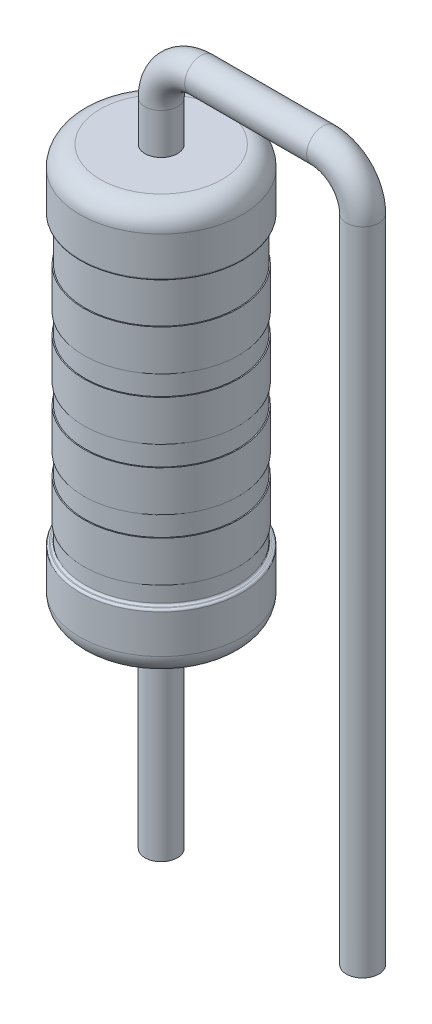
ISO-10303-21;
HEADER;
FILE_DESCRIPTION(('STEP AP214'),'2;1');
FILE_NAME('part.step','',(''),(''),'','','');
FILE_SCHEMA(('AUTOMOTIVE_DESIGN { 1 0 10303 214 1 1 1 1 }'));
ENDSEC;
DATA;
#1=APPLICATION_CONTEXT('core data for automotive mechanical design processes');
#2=APPLICATION_PROTOCOL_DEFINITION('international standard','automotive_design',2000,#1);
#3=PRODUCT_CONTEXT('',#1,'mechanical');
#4=PRODUCT('Part','Part','',(#3));
#5=PRODUCT_RELATED_PRODUCT_CATEGORY('part','',(#4));
#6=PRODUCT_DEFINITION_FORMATION('','',#4);
#7=PRODUCT_DEFINITION_CONTEXT('part definition',#1,'design');
#8=PRODUCT_DEFINITION('design','',#6,#7);
#9=PRODUCT_DEFINITION_SHAPE('','',#8);
#10=(LENGTH_UNIT() NAMED_UNIT(*) SI_UNIT(.MILLI.,.METRE.));
#11=(NAMED_UNIT(*) PLANE_ANGLE_UNIT() SI_UNIT($,.RADIAN.));
#12=(NAMED_UNIT(*) SI_UNIT($,.STERADIAN.) SOLID_ANGLE_UNIT());
#13=UNCERTAINTY_MEASURE_WITH_UNIT(LENGTH_MEASURE(1.E-05),#10,'distance_accuracy_value','');
#14=(GEOMETRIC_REPRESENTATION_CONTEXT(3) GLOBAL_UNCERTAINTY_ASSIGNED_CONTEXT((#13)) GLOBAL_UNIT_ASSIGNED_CONTEXT((#10,
#11,#12)) REPRESENTATION_CONTEXT('',''));
#15=CARTESIAN_POINT('',(0.,0.,0.));
#16=DIRECTION('',(0.,0.,1.));
#17=DIRECTION('',(1.,0.,0.));
#18=AXIS2_PLACEMENT_3D('',#15,#16,#17);
#19=CARTESIAN_POINT('',(0.,5.,0.));
#20=DIRECTION('',(0.,1.,0.));
#21=DIRECTION('',(0.,0.,1.));
#22=AXIS2_PLACEMENT_3D('',#19,#20,#21);
#23=CYLINDRICAL_SURFACE('',#22,1.875);
#24=CARTESIAN_POINT('',(0.,-2.05,0.));
#25=DIRECTION('',(0.,1.,0.));
#26=DIRECTION('',(0.,0.,1.));
#27=AXIS2_PLACEMENT_3D('',#24,#25,#26);
#28=CIRCLE('',#27,1.875);
#29=CARTESIAN_POINT('',(0.,-2.05,1.875));
#30=VERTEX_POINT('',#29);
#31=EDGE_CURVE('E11',#30,#30,#28,.F.);
#32=ORIENTED_EDGE('',*,*,#31,.F.);
#33=EDGE_LOOP('',(#32));
#34=FACE_BOUND('',#33,.T.);
#35=CARTESIAN_POINT('',(0.,-1.55,0.));
#36=DIRECTION('',(0.,-1.,0.));
#37=DIRECTION('',(0.,0.,-1.));
#38=AXIS2_PLACEMENT_3D('',#35,#36,#37);
#39=CIRCLE('',#38,1.875);
#40=CARTESIAN_POINT('',(0.,-1.55,-1.875));
#41=VERTEX_POINT('',#40);
#42=EDGE_CURVE('E138',#41,#41,#39,.F.);
#43=ORIENTED_EDGE('',*,*,#42,.F.);
#44=EDGE_LOOP('',(#43));
#45=FACE_BOUND('',#44,.T.);
#46=ADVANCED_FACE('F41',(#34,#45),#23,.T.);
#47=CARTESIAN_POINT('',(0.,-0.549999999999997,0.));
#48=DIRECTION('',(0.,1.,0.));
#49=DIRECTION('',(0.,0.,1.));
#50=AXIS2_PLACEMENT_3D('',#47,#48,#49);
#51=CIRCLE('',#50,1.875);
#52=CARTESIAN_POINT('',(0.,-0.549999999999997,1.875));
#53=VERTEX_POINT('',#52);
#54=EDGE_CURVE('E142',#53,#53,#51,.F.);
#55=ORIENTED_EDGE('',*,*,#54,.F.);
#56=EDGE_LOOP('',(#55));
#57=FACE_BOUND('',#56,.T.);
#58=CARTESIAN_POINT('',(0.,-0.0499999999999988,0.));
#59=DIRECTION('',(0.,-1.,0.));
#60=DIRECTION('',(0.,0.,-1.));
#61=AXIS2_PLACEMENT_3D('',#58,#59,#60);
#62=CIRCLE('',#61,1.875);
#63=CARTESIAN_POINT('',(0.,-0.0499999999999988,-1.875));
#64=VERTEX_POINT('',#63);
#65=EDGE_CURVE('E130',#64,#64,#62,.F.);
#66=ORIENTED_EDGE('',*,*,#65,.F.);
#67=EDGE_LOOP('',(#66));
#68=FACE_BOUND('',#67,.T.);
#69=ADVANCED_FACE('F173',(#57,#68),#23,.T.);
#70=CARTESIAN_POINT('',(0.,0.950000000000001,0.));
#71=DIRECTION('',(0.,1.,0.));
#72=DIRECTION('',(0.,0.,1.));
#73=AXIS2_PLACEMENT_3D('',#70,#71,#72);
#74=CIRCLE('',#73,1.875);
#75=CARTESIAN_POINT('',(0.,0.950000000000001,1.875));
#76=VERTEX_POINT('',#75);
#77=EDGE_CURVE('E134',#76,#76,#74,.F.);
#78=ORIENTED_EDGE('',*,*,#77,.F.);
#79=EDGE_LOOP('',(#78));
#80=FACE_BOUND('',#79,.T.);
#81=CARTESIAN_POINT('',(0.,1.45,0.));
#82=DIRECTION('',(0.,-1.,0.));
#83=DIRECTION('',(0.,0.,-1.));
#84=AXIS2_PLACEMENT_3D('',#81,#82,#83);
#85=CIRCLE('',#84,1.875);
#86=CARTESIAN_POINT('',(0.,1.45,-1.875));
#87=VERTEX_POINT('',#86);
#88=EDGE_CURVE('E122',#87,#87,#85,.F.);
#89=ORIENTED_EDGE('',*,*,#88,.F.);
#90=EDGE_LOOP('',(#89));
#91=FACE_BOUND('',#90,.T.);
#92=ADVANCED_FACE('F178',(#80,#91),#23,.T.);
#93=CARTESIAN_POINT('',(0.,2.45,0.));
#94=DIRECTION('',(0.,1.,0.));
#95=DIRECTION('',(0.,0.,1.));
#96=AXIS2_PLACEMENT_3D('',#93,#94,#95);
#97=CIRCLE('',#96,1.875);
#98=CARTESIAN_POINT('',(0.,2.45,1.875));
#99=VERTEX_POINT('',#98);
#100=EDGE_CURVE('E126',#99,#99,#97,.F.);
#101=ORIENTED_EDGE('',*,*,#100,.F.);
#102=EDGE_LOOP('',(#101));
#103=FACE_BOUND('',#102,.T.);
#104=CARTESIAN_POINT('',(0.,3.45,0.));
#105=DIRECTION('',(0.,1.,0.));
#106=DIRECTION('',(0.,0.,1.));
#107=AXIS2_PLACEMENT_3D('',#104,#105,#106);
#108=CIRCLE('',#107,1.875);
#109=CARTESIAN_POINT('',(0.,3.45,1.875));
#110=VERTEX_POINT('',#109);
#111=EDGE_CURVE('E98',#110,#110,#108,.T.);
#112=ORIENTED_EDGE('',*,*,#111,.F.);
#113=EDGE_LOOP('',(#112));
#114=FACE_BOUND('',#113,.T.);
#115=ADVANCED_FACE('F159',(#103,#114),#23,.T.);
#116=CARTESIAN_POINT('',(-1.5,5.,0.));
#117=DIRECTION('',(0.,1.,0.));
#118=DIRECTION('',(0.,0.,1.));
#119=AXIS2_PLACEMENT_3D('',#116,#117,#118);
#120=PLANE('',#119);
#121=CARTESIAN_POINT('',(0.,5.,0.));
#122=DIRECTION('',(0.,1.,0.));
#123=DIRECTION('',(0.,0.,1.));
#124=AXIS2_PLACEMENT_3D('',#121,#122,#123);
#125=CIRCLE('',#124,0.4);
#126=CARTESIAN_POINT('',(0.,5.,0.4));
#127=VERTEX_POINT('',#126);
#128=EDGE_CURVE('E121',#127,#127,#125,.T.);
#129=ORIENTED_EDGE('',*,*,#128,.F.);
#130=EDGE_LOOP('',(#129));
#131=FACE_BOUND('',#130,.T.);
#132=CARTESIAN_POINT('',(0.,5.,0.));
#133=DIRECTION('',(0.,1.,0.));
#134=DIRECTION('',(0.,0.,1.));
#135=AXIS2_PLACEMENT_3D('',#132,#133,#134);
#136=CIRCLE('',#135,1.5);
#137=CARTESIAN_POINT('',(0.,5.,1.5));
#138=VERTEX_POINT('',#137);
#139=EDGE_CURVE('E118',#138,#138,#136,.T.);
#140=ORIENTED_EDGE('',*,*,#139,.T.);
#141=EDGE_LOOP('',(#140));
#142=FACE_BOUND('',#141,.T.);
#143=ADVANCED_FACE('F43',(#131,#142),#120,.T.);
#144=CARTESIAN_POINT('',(0.,4.5,0.));
#145=DIRECTION('',(0.,1.,0.));
#146=DIRECTION('',(0.,0.,1.));
#147=AXIS2_PLACEMENT_3D('',#144,#145,#146);
#148=TOROIDAL_SURFACE('',#147,1.5,0.5);
#149=CARTESIAN_POINT('',(0.,4.5,0.));
#150=DIRECTION('',(0.,1.,0.));
#151=DIRECTION('',(0.,0.,1.));
#152=AXIS2_PLACEMENT_3D('',#149,#150,#151);
#153=CIRCLE('',#152,2.);
#154=CARTESIAN_POINT('',(0.,4.5,2.));
#155=VERTEX_POINT('',#154);
#156=EDGE_CURVE('E114',#155,#155,#153,.T.);
#157=ORIENTED_EDGE('',*,*,#156,.T.);
#158=EDGE_LOOP('',(#157));
#159=FACE_BOUND('',#158,.T.);
#160=ORIENTED_EDGE('',*,*,#139,.F.);
#161=EDGE_LOOP('',(#160));
#162=FACE_BOUND('',#161,.T.);
#163=ADVANCED_FACE('F198',(#159,#162),#148,.T.);
#164=CARTESIAN_POINT('',(0.,5.,0.));
#165=DIRECTION('',(0.,1.,0.));
#166=DIRECTION('',(0.,0.,1.));
#167=AXIS2_PLACEMENT_3D('',#164,#165,#166);
#168=CYLINDRICAL_SURFACE('',#167,2.);
#169=CARTESIAN_POINT('',(0.,3.55,0.));
#170=DIRECTION('',(0.,1.,0.));
#171=DIRECTION('',(0.,0.,1.));
#172=AXIS2_PLACEMENT_3D('',#169,#170,#171);
#173=CIRCLE('',#172,2.);
#174=CARTESIAN_POINT('',(0.,3.55,2.));
#175=VERTEX_POINT('',#174);
#176=EDGE_CURVE('E110',#175,#175,#173,.T.);
#177=ORIENTED_EDGE('',*,*,#176,.T.);
#178=EDGE_LOOP('',(#177));
#179=FACE_BOUND('',#178,.T.);
#180=ORIENTED_EDGE('',*,*,#156,.F.);
#181=EDGE_LOOP('',(#180));
#182=FACE_BOUND('',#181,.T.);
#183=ADVANCED_FACE('F195',(#179,#182),#168,.T.);
#184=CARTESIAN_POINT('',(0.,3.55,0.));
#185=DIRECTION('',(0.,1.,0.));
#186=DIRECTION('',(0.,0.,1.));
#187=AXIS2_PLACEMENT_3D('',#184,#185,#186);
#188=TOROIDAL_SURFACE('',#187,1.95,0.05);
#189=CARTESIAN_POINT('',(0.,3.5,0.));
#190=DIRECTION('',(0.,1.,0.));
#191=DIRECTION('',(0.,0.,1.));
#192=AXIS2_PLACEMENT_3D('',#189,#190,#191);
#193=CIRCLE('',#192,1.95);
#194=CARTESIAN_POINT('',(0.,3.5,1.95));
#195=VERTEX_POINT('',#194);
#196=EDGE_CURVE('E106',#195,#195,#193,.T.);
#197=ORIENTED_EDGE('',*,*,#196,.T.);
#198=EDGE_LOOP('',(#197));
#199=FACE_BOUND('',#198,.T.);
#200=ORIENTED_EDGE('',*,*,#176,.F.);
#201=EDGE_LOOP('',(#200));
#202=FACE_BOUND('',#201,.T.);
#203=ADVANCED_FACE('F191',(#199,#202),#188,.T.);
#204=CARTESIAN_POINT('',(-1.925,3.5,0.));
#205=DIRECTION('',(0.,-1.,0.));
#206=DIRECTION('',(0.,0.,-1.));
#207=AXIS2_PLACEMENT_3D('',#204,#205,#206);
#208=PLANE('',#207);
#209=CARTESIAN_POINT('',(0.,3.5,0.));
#210=DIRECTION('',(0.,1.,0.));
#211=DIRECTION('',(0.,0.,1.));
#212=AXIS2_PLACEMENT_3D('',#209,#210,#211);
#213=CIRCLE('',#212,1.925);
#214=CARTESIAN_POINT('',(0.,3.5,1.925));
#215=VERTEX_POINT('',#214);
#216=EDGE_CURVE('E102',#215,#215,#213,.T.);
#217=ORIENTED_EDGE('',*,*,#216,.T.);
#218=EDGE_LOOP('',(#217));
#219=FACE_BOUND('',#218,.T.);
#220=ORIENTED_EDGE('',*,*,#196,.F.);
#221=EDGE_LOOP('',(#220));
#222=FACE_BOUND('',#221,.T.);
#223=ADVANCED_FACE('F186',(#219,#222),#208,.T.);
#224=CARTESIAN_POINT('',(0.,3.45,0.));
#225=DIRECTION('',(0.,1.,0.));
#226=DIRECTION('',(0.,0.,1.));
#227=AXIS2_PLACEMENT_3D('',#224,#225,#226);
#228=TOROIDAL_SURFACE('',#227,1.925,0.0500000000000002);
#229=ORIENTED_EDGE('',*,*,#111,.T.);
#230=EDGE_LOOP('',(#229));
#231=FACE_BOUND('',#230,.T.);
#232=ORIENTED_EDGE('',*,*,#216,.F.);
#233=EDGE_LOOP('',(#232));
#234=FACE_BOUND('',#233,.T.);
#235=ADVANCED_FACE('F183',(#231,#234),#228,.F.);
#236=CARTESIAN_POINT('',(4.95421989738189,-10.,0.));
#237=DIRECTION('',(0.,-1.,0.));
#238=DIRECTION('',(0.,0.,1.));
#239=AXIS2_PLACEMENT_3D('',#236,#237,#238);
#240=PLANE('',#239);
#241=CARTESIAN_POINT('',(4.95421989738189,-10.,0.));
#242=DIRECTION('',(0.,-1.,0.));
#243=DIRECTION('',(0.,0.,1.));
#244=AXIS2_PLACEMENT_3D('',#241,#242,#243);
#245=CIRCLE('',#244,0.4);
#246=CARTESIAN_POINT('',(4.95421989738189,-10.,0.4));
#247=VERTEX_POINT('',#246);
#248=EDGE_CURVE('E53',#247,#247,#245,.T.);
#249=ORIENTED_EDGE('',*,*,#248,.T.);
#250=EDGE_LOOP('',(#249));
#251=FACE_BOUND('',#250,.T.);
#252=ADVANCED_FACE('F54',(#251),#240,.T.);
#253=CARTESIAN_POINT('',(0.,5.,0.));
#254=DIRECTION('',(0.,1.,0.));
#255=DIRECTION('',(0.,0.,1.));
#256=AXIS2_PLACEMENT_3D('',#253,#254,#255);
#257=CYLINDRICAL_SURFACE('',#256,0.4);
#258=CARTESIAN_POINT('',(0.,5.99999999999999,0.));
#259=DIRECTION('',(0.,1.,0.));
#260=DIRECTION('',(0.,0.,1.));
#261=AXIS2_PLACEMENT_3D('',#258,#259,#260);
#262=CIRCLE('',#261,0.4);
#263=CARTESIAN_POINT('',(-0.399999999999965,5.99999999999999,0.));
#264=VERTEX_POINT('',#263);
#265=EDGE_CURVE('E226',#264,#264,#262,.T.);
#266=ORIENTED_EDGE('',*,*,#265,.F.);
#267=EDGE_LOOP('',(#266));
#268=FACE_BOUND('',#267,.T.);
#269=ORIENTED_EDGE('',*,*,#128,.T.);
#270=EDGE_LOOP('',(#269));
#271=FACE_BOUND('',#270,.T.);
#272=ADVANCED_FACE('F248',(#268,#271),#257,.T.);
#273=CARTESIAN_POINT('',(0.977109948690943,6.,0.));
#274=DIRECTION('',(0.,0.,-1.));
#275=DIRECTION('',(-1.,0.,0.));
#276=AXIS2_PLACEMENT_3D('',#273,#274,#275);
#277=TOROIDAL_SURFACE('',#276,0.977109948690908,0.4);
#278=CARTESIAN_POINT('',(0.977109948690948,6.97710994869095,0.));
#279=DIRECTION('',(1.,0.,0.));
#280=DIRECTION('',(0.,0.,1.));
#281=AXIS2_PLACEMENT_3D('',#278,#279,#280);
#282=CIRCLE('',#281,0.4);
#283=CARTESIAN_POINT('',(0.97710994869095,7.37710994869091,0.));
#284=VERTEX_POINT('',#283);
#285=EDGE_CURVE('E230',#284,#284,#282,.T.);
#286=CARTESIAN_POINT('',(0.977109948690943,6.,0.));
#287=DIRECTION('',(0.,0.,-1.));
#288=DIRECTION('',(-1.,0.,0.));
#289=AXIS2_PLACEMENT_3D('',#286,#287,#288);
#290=CIRCLE('',#289,1.37710994869091);
#291=EDGE_CURVE('',#264,#284,#290,.T.);
#292=ORIENTED_EDGE('',*,*,#265,.T.);
#293=ORIENTED_EDGE('',*,*,#285,.F.);
#294=ORIENTED_EDGE('',*,*,#291,.T.);
#295=ORIENTED_EDGE('',*,*,#291,.F.);
#296=EDGE_LOOP('',(#292,#294,#293,#295));
#297=FACE_BOUND('',#296,.T.);
#298=ADVANCED_FACE('F242',(#297),#277,.T.);
#299=CARTESIAN_POINT('',(0.977109948690948,6.97710994869095,0.));
#300=DIRECTION('',(1.,0.,0.));
#301=DIRECTION('',(0.,1.,0.));
#302=AXIS2_PLACEMENT_3D('',#299,#300,#301);
#303=CYLINDRICAL_SURFACE('',#302,0.4);
#304=CARTESIAN_POINT('',(3.97710994869094,6.97710994869094,0.));
#305=DIRECTION('',(1.,0.,0.));
#306=DIRECTION('',(0.,0.,1.));
#307=AXIS2_PLACEMENT_3D('',#304,#305,#306);
#308=CIRCLE('',#307,0.4);
#309=CARTESIAN_POINT('',(3.97710994869094,7.37710994869094,0.));
#310=VERTEX_POINT('',#309);
#311=EDGE_CURVE('E68',#310,#310,#308,.T.);
#312=ORIENTED_EDGE('',*,*,#311,.F.);
#313=EDGE_LOOP('',(#312));
#314=FACE_BOUND('',#313,.T.);
#315=ORIENTED_EDGE('',*,*,#285,.T.);
#316=EDGE_LOOP('',(#315));
#317=FACE_BOUND('',#316,.T.);
#318=ADVANCED_FACE('F239',(#314,#317),#303,.T.);
#319=CARTESIAN_POINT('',(3.97710994869094,6.,0.));
#320=DIRECTION('',(0.,0.,-1.));
#321=DIRECTION('',(-1.,0.,0.));
#322=AXIS2_PLACEMENT_3D('',#319,#320,#321);
#323=TOROIDAL_SURFACE('',#322,0.977109948690943,0.4);
#324=CARTESIAN_POINT('',(4.95421989738189,6.,0.));
#325=DIRECTION('',(0.,-1.,0.));
#326=DIRECTION('',(0.,0.,1.));
#327=AXIS2_PLACEMENT_3D('',#324,#325,#326);
#328=CIRCLE('',#327,0.4);
#329=CARTESIAN_POINT('',(5.35421989738189,6.,0.));
#330=VERTEX_POINT('',#329);
#331=EDGE_CURVE('E58',#330,#330,#328,.T.);
#332=CARTESIAN_POINT('',(3.97710994869094,6.,0.));
#333=DIRECTION('',(0.,0.,-1.));
#334=DIRECTION('',(-1.,0.,0.));
#335=AXIS2_PLACEMENT_3D('',#332,#333,#334);
#336=CIRCLE('',#335,1.37710994869094);
#337=EDGE_CURVE('',#310,#330,#336,.T.);
#338=ORIENTED_EDGE('',*,*,#311,.T.);
#339=ORIENTED_EDGE('',*,*,#331,.F.);
#340=ORIENTED_EDGE('',*,*,#337,.T.);
#341=ORIENTED_EDGE('',*,*,#337,.F.);
#342=EDGE_LOOP('',(#338,#340,#339,#341));
#343=FACE_BOUND('',#342,.T.);
#344=ADVANCED_FACE('F237',(#343),#323,.T.);
#345=CARTESIAN_POINT('',(4.95421989738189,6.,0.));
#346=DIRECTION('',(0.,-1.,0.));
#347=DIRECTION('',(1.,0.,0.));
#348=AXIS2_PLACEMENT_3D('',#345,#346,#347);
#349=CYLINDRICAL_SURFACE('',#348,0.4);
#350=ORIENTED_EDGE('',*,*,#248,.F.);
#351=EDGE_LOOP('',(#350));
#352=FACE_BOUND('',#351,.T.);
#353=ORIENTED_EDGE('',*,*,#331,.T.);
#354=EDGE_LOOP('',(#353));
#355=FACE_BOUND('',#354,.T.);
#356=ADVANCED_FACE('F188',(#352,#355),#349,.T.);
#357=CARTESIAN_POINT('',(0.,5.02657804199377,0.));
#358=DIRECTION('',(0.,1.,0.));
#359=DIRECTION('',(0.,0.,1.));
#360=AXIS2_PLACEMENT_3D('',#357,#358,#359);
#361=CYLINDRICAL_SURFACE('',#360,1.9);
#362=CARTESIAN_POINT('',(0.,1.45,0.));
#363=DIRECTION('',(0.,1.,0.));
#364=DIRECTION('',(0.,0.,1.));
#365=AXIS2_PLACEMENT_3D('',#362,#363,#364);
#366=CIRCLE('',#365,1.9);
#367=CARTESIAN_POINT('',(0.,1.45,1.9));
#368=VERTEX_POINT('',#367);
#369=EDGE_CURVE('E601',#368,#368,#366,.T.);
#370=ORIENTED_EDGE('',*,*,#369,.T.);
#371=EDGE_LOOP('',(#370));
#372=FACE_BOUND('',#371,.T.);
#373=CARTESIAN_POINT('',(0.,2.45,0.));
#374=DIRECTION('',(0.,1.,0.));
#375=DIRECTION('',(0.,0.,1.));
#376=AXIS2_PLACEMENT_3D('',#373,#374,#375);
#377=CIRCLE('',#376,1.9);
#378=CARTESIAN_POINT('',(0.,2.45,1.9));
#379=VERTEX_POINT('',#378);
#380=EDGE_CURVE('E224',#379,#379,#377,.T.);
#381=ORIENTED_EDGE('',*,*,#380,.F.);
#382=EDGE_LOOP('',(#381));
#383=FACE_BOUND('',#382,.T.);
#384=ADVANCED_FACE('F258',(#372,#383),#361,.T.);
#385=CARTESIAN_POINT('',(-1.85,2.45,0.));
#386=DIRECTION('',(0.,1.,0.));
#387=DIRECTION('',(0.,0.,1.));
#388=AXIS2_PLACEMENT_3D('',#385,#386,#387);
#389=PLANE('',#388);
#390=ORIENTED_EDGE('',*,*,#100,.T.);
#391=EDGE_LOOP('',(#390));
#392=FACE_BOUND('',#391,.T.);
#393=ORIENTED_EDGE('',*,*,#380,.T.);
#394=EDGE_LOOP('',(#393));
#395=FACE_BOUND('',#394,.T.);
#396=ADVANCED_FACE('F418',(#392,#395),#389,.T.);
#397=CARTESIAN_POINT('',(-1.85,1.45,0.));
#398=DIRECTION('',(0.,-1.,0.));
#399=DIRECTION('',(0.,0.,-1.));
#400=AXIS2_PLACEMENT_3D('',#397,#398,#399);
#401=PLANE('',#400);
#402=ORIENTED_EDGE('',*,*,#88,.T.);
#403=EDGE_LOOP('',(#402));
#404=FACE_BOUND('',#403,.T.);
#405=ORIENTED_EDGE('',*,*,#369,.F.);
#406=EDGE_LOOP('',(#405));
#407=FACE_BOUND('',#406,.T.);
#408=ADVANCED_FACE('F407',(#404,#407),#401,.T.);
#409=CARTESIAN_POINT('',(0.,5.02657804199377,0.));
#410=DIRECTION('',(0.,1.,0.));
#411=DIRECTION('',(0.,0.,1.));
#412=AXIS2_PLACEMENT_3D('',#409,#410,#411);
#413=CYLINDRICAL_SURFACE('',#412,1.89999999999998);
#414=CARTESIAN_POINT('',(0.,-0.0499999999999988,0.));
#415=DIRECTION('',(0.,1.,0.));
#416=DIRECTION('',(0.,0.,1.));
#417=AXIS2_PLACEMENT_3D('',#414,#415,#416);
#418=CIRCLE('',#417,1.89999999999998);
#419=CARTESIAN_POINT('',(0.,-0.0499999999999988,1.89999999999998));
#420=VERTEX_POINT('',#419);
#421=EDGE_CURVE('E606',#420,#420,#418,.T.);
#422=ORIENTED_EDGE('',*,*,#421,.T.);
#423=EDGE_LOOP('',(#422));
#424=FACE_BOUND('',#423,.T.);
#425=CARTESIAN_POINT('',(0.,0.950000000000001,0.));
#426=DIRECTION('',(0.,1.,0.));
#427=DIRECTION('',(0.,0.,1.));
#428=AXIS2_PLACEMENT_3D('',#425,#426,#427);
#429=CIRCLE('',#428,1.89999999999998);
#430=CARTESIAN_POINT('',(0.,0.950000000000001,1.89999999999998));
#431=VERTEX_POINT('',#430);
#432=EDGE_CURVE('E602',#431,#431,#429,.T.);
#433=ORIENTED_EDGE('',*,*,#432,.F.);
#434=EDGE_LOOP('',(#433));
#435=FACE_BOUND('',#434,.T.);
#436=ADVANCED_FACE('F397',(#424,#435),#413,.T.);
#437=CARTESIAN_POINT('',(-1.84999999999998,0.950000000000001,0.));
#438=DIRECTION('',(0.,1.,0.));
#439=DIRECTION('',(0.,0.,1.));
#440=AXIS2_PLACEMENT_3D('',#437,#438,#439);
#441=PLANE('',#440);
#442=ORIENTED_EDGE('',*,*,#77,.T.);
#443=EDGE_LOOP('',(#442));
#444=FACE_BOUND('',#443,.T.);
#445=ORIENTED_EDGE('',*,*,#432,.T.);
#446=EDGE_LOOP('',(#445));
#447=FACE_BOUND('',#446,.T.);
#448=ADVANCED_FACE('F387',(#444,#447),#441,.T.);
#449=CARTESIAN_POINT('',(-1.84999999999998,-0.0499999999999988,0.));
#450=DIRECTION('',(0.,-1.,0.));
#451=DIRECTION('',(0.,0.,-1.));
#452=AXIS2_PLACEMENT_3D('',#449,#450,#451);
#453=PLANE('',#452);
#454=ORIENTED_EDGE('',*,*,#65,.T.);
#455=EDGE_LOOP('',(#454));
#456=FACE_BOUND('',#455,.T.);
#457=ORIENTED_EDGE('',*,*,#421,.F.);
#458=EDGE_LOOP('',(#457));
#459=FACE_BOUND('',#458,.T.);
#460=ADVANCED_FACE('F374',(#456,#459),#453,.T.);
#461=CARTESIAN_POINT('',(0.,5.02657804199377,0.));
#462=DIRECTION('',(0.,1.,0.));
#463=DIRECTION('',(0.,0.,1.));
#464=AXIS2_PLACEMENT_3D('',#461,#462,#463);
#465=CYLINDRICAL_SURFACE('',#464,1.89999999999997);
#466=CARTESIAN_POINT('',(0.,-1.55,0.));
#467=DIRECTION('',(0.,1.,0.));
#468=DIRECTION('',(0.,0.,1.));
#469=AXIS2_PLACEMENT_3D('',#466,#467,#468);
#470=CIRCLE('',#469,1.89999999999997);
#471=CARTESIAN_POINT('',(0.,-1.55,1.89999999999997));
#472=VERTEX_POINT('',#471);
#473=EDGE_CURVE('E616',#472,#472,#470,.T.);
#474=ORIENTED_EDGE('',*,*,#473,.T.);
#475=EDGE_LOOP('',(#474));
#476=FACE_BOUND('',#475,.T.);
#477=CARTESIAN_POINT('',(0.,-0.549999999999998,0.));
#478=DIRECTION('',(0.,1.,0.));
#479=DIRECTION('',(0.,0.,1.));
#480=AXIS2_PLACEMENT_3D('',#477,#478,#479);
#481=CIRCLE('',#480,1.89999999999997);
#482=CARTESIAN_POINT('',(0.,-0.549999999999998,1.89999999999997));
#483=VERTEX_POINT('',#482);
#484=EDGE_CURVE('E612',#483,#483,#481,.T.);
#485=ORIENTED_EDGE('',*,*,#484,.F.);
#486=EDGE_LOOP('',(#485));
#487=FACE_BOUND('',#486,.T.);
#488=ADVANCED_FACE('F363',(#476,#487),#465,.T.);
#489=CARTESIAN_POINT('',(-1.84999999999997,-0.549999999999998,0.));
#490=DIRECTION('',(0.,1.,0.));
#491=DIRECTION('',(0.,0.,1.));
#492=AXIS2_PLACEMENT_3D('',#489,#490,#491);
#493=PLANE('',#492);
#494=ORIENTED_EDGE('',*,*,#54,.T.);
#495=EDGE_LOOP('',(#494));
#496=FACE_BOUND('',#495,.T.);
#497=ORIENTED_EDGE('',*,*,#484,.T.);
#498=EDGE_LOOP('',(#497));
#499=FACE_BOUND('',#498,.T.);
#500=ADVANCED_FACE('F353',(#496,#499),#493,.T.);
#501=CARTESIAN_POINT('',(-1.84999999999997,-1.55,0.));
#502=DIRECTION('',(0.,-1.,0.));
#503=DIRECTION('',(0.,0.,-1.));
#504=AXIS2_PLACEMENT_3D('',#501,#502,#503);
#505=PLANE('',#504);
#506=ORIENTED_EDGE('',*,*,#42,.T.);
#507=EDGE_LOOP('',(#506));
#508=FACE_BOUND('',#507,.T.);
#509=ORIENTED_EDGE('',*,*,#473,.F.);
#510=EDGE_LOOP('',(#509));
#511=FACE_BOUND('',#510,.T.);
#512=ADVANCED_FACE('F343',(#508,#511),#505,.T.);
#513=CARTESIAN_POINT('',(0.,5.02657804199377,0.));
#514=DIRECTION('',(0.,1.,0.));
#515=DIRECTION('',(0.,0.,1.));
#516=AXIS2_PLACEMENT_3D('',#513,#514,#515);
#517=CYLINDRICAL_SURFACE('',#516,1.89999999999995);
#518=CARTESIAN_POINT('',(0.,-3.05,0.));
#519=DIRECTION('',(0.,1.,0.));
#520=DIRECTION('',(0.,0.,1.));
#521=AXIS2_PLACEMENT_3D('',#518,#519,#520);
#522=CIRCLE('',#521,1.89999999999995);
#523=CARTESIAN_POINT('',(0.,-3.05,1.89999999999995));
#524=VERTEX_POINT('',#523);
#525=EDGE_CURVE('E622',#524,#524,#522,.T.);
#526=ORIENTED_EDGE('',*,*,#525,.T.);
#527=EDGE_LOOP('',(#526));
#528=FACE_BOUND('',#527,.T.);
#529=CARTESIAN_POINT('',(0.,-2.05,0.));
#530=DIRECTION('',(0.,1.,0.));
#531=DIRECTION('',(0.,0.,1.));
#532=AXIS2_PLACEMENT_3D('',#529,#530,#531);
#533=CIRCLE('',#532,1.89999999999995);
#534=CARTESIAN_POINT('',(0.,-2.05,1.89999999999995));
#535=VERTEX_POINT('',#534);
#536=EDGE_CURVE('E619',#535,#535,#533,.T.);
#537=ORIENTED_EDGE('',*,*,#536,.F.);
#538=EDGE_LOOP('',(#537));
#539=FACE_BOUND('',#538,.T.);
#540=ADVANCED_FACE('F333',(#528,#539),#517,.T.);
#541=CARTESIAN_POINT('',(-1.84999999999995,-2.05,0.));
#542=DIRECTION('',(0.,1.,0.));
#543=DIRECTION('',(0.,0.,1.));
#544=AXIS2_PLACEMENT_3D('',#541,#542,#543);
#545=PLANE('',#544);
#546=ORIENTED_EDGE('',*,*,#31,.T.);
#547=EDGE_LOOP('',(#546));
#548=FACE_BOUND('',#547,.T.);
#549=ORIENTED_EDGE('',*,*,#536,.T.);
#550=EDGE_LOOP('',(#549));
#551=FACE_BOUND('',#550,.T.);
#552=ADVANCED_FACE('F323',(#548,#551),#545,.T.);
#553=CARTESIAN_POINT('',(-1.84999999999995,-3.05,0.));
#554=DIRECTION('',(0.,-1.,0.));
#555=DIRECTION('',(0.,0.,-1.));
#556=AXIS2_PLACEMENT_3D('',#553,#554,#555);
#557=PLANE('',#556);
#558=CARTESIAN_POINT('',(0.,-3.05,0.));
#559=DIRECTION('',(0.,-1.,0.));
#560=DIRECTION('',(0.,0.,-1.));
#561=AXIS2_PLACEMENT_3D('',#558,#559,#560);
#562=CIRCLE('',#561,1.875);
#563=CARTESIAN_POINT('',(0.,-3.05,-1.875));
#564=VERTEX_POINT('',#563);
#565=EDGE_CURVE('E49',#564,#564,#562,.F.);
#566=ORIENTED_EDGE('',*,*,#565,.T.);
#567=EDGE_LOOP('',(#566));
#568=FACE_BOUND('',#567,.T.);
#569=ORIENTED_EDGE('',*,*,#525,.F.);
#570=EDGE_LOOP('',(#569));
#571=FACE_BOUND('',#570,.T.);
#572=ADVANCED_FACE('F151',(#568,#571),#557,.T.);
#573=CARTESIAN_POINT('',(0.,-10.,0.));
#574=DIRECTION('',(0.,-1.,0.));
#575=DIRECTION('',(0.,0.,-1.));
#576=AXIS2_PLACEMENT_3D('',#573,#574,#575);
#577=PLANE('',#576);
#578=CARTESIAN_POINT('',(0.,-10.,0.));
#579=DIRECTION('',(0.,-1.,0.));
#580=DIRECTION('',(0.,0.,-1.));
#581=AXIS2_PLACEMENT_3D('',#578,#579,#580);
#582=CIRCLE('',#581,0.4);
#583=CARTESIAN_POINT('',(0.,-10.,-0.4));
#584=VERTEX_POINT('',#583);
#585=EDGE_CURVE('E64',#584,#584,#582,.T.);
#586=ORIENTED_EDGE('',*,*,#585,.T.);
#587=EDGE_LOOP('',(#586));
#588=FACE_BOUND('',#587,.T.);
#589=ADVANCED_FACE('F267',(#588),#577,.T.);
#590=CARTESIAN_POINT('',(0.,-10.,0.));
#591=DIRECTION('',(0.,1.,0.));
#592=DIRECTION('',(0.,0.,1.));
#593=AXIS2_PLACEMENT_3D('',#590,#591,#592);
#594=CYLINDRICAL_SURFACE('',#593,0.4);
#595=ORIENTED_EDGE('',*,*,#585,.F.);
#596=EDGE_LOOP('',(#595));
#597=FACE_BOUND('',#596,.T.);
#598=CARTESIAN_POINT('',(0.,-5.,0.));
#599=DIRECTION('',(0.,-1.,0.));
#600=DIRECTION('',(0.,0.,-1.));
#601=AXIS2_PLACEMENT_3D('',#598,#599,#600);
#602=CIRCLE('',#601,0.4);
#603=CARTESIAN_POINT('',(0.,-5.,-0.4));
#604=VERTEX_POINT('',#603);
#605=EDGE_CURVE('E57',#604,#604,#602,.T.);
#606=ORIENTED_EDGE('',*,*,#605,.T.);
#607=EDGE_LOOP('',(#606));
#608=FACE_BOUND('',#607,.T.);
#609=ADVANCED_FACE('F270',(#597,#608),#594,.T.);
#610=CARTESIAN_POINT('',(-1.5,-5.,0.));
#611=DIRECTION('',(0.,-1.,0.));
#612=DIRECTION('',(0.,0.,-1.));
#613=AXIS2_PLACEMENT_3D('',#610,#611,#612);
#614=PLANE('',#613);
#615=ORIENTED_EDGE('',*,*,#605,.F.);
#616=EDGE_LOOP('',(#615));
#617=FACE_BOUND('',#616,.T.);
#618=CARTESIAN_POINT('',(0.,-5.,0.));
#619=DIRECTION('',(0.,1.,0.));
#620=DIRECTION('',(0.,0.,1.));
#621=AXIS2_PLACEMENT_3D('',#618,#619,#620);
#622=CIRCLE('',#621,1.5);
#623=CARTESIAN_POINT('',(0.,-5.,1.5));
#624=VERTEX_POINT('',#623);
#625=EDGE_CURVE('E74',#624,#624,#622,.T.);
#626=ORIENTED_EDGE('',*,*,#625,.F.);
#627=EDGE_LOOP('',(#626));
#628=FACE_BOUND('',#627,.T.);
#629=ADVANCED_FACE('F274',(#617,#628),#614,.T.);
#630=CARTESIAN_POINT('',(0.,-4.5,0.));
#631=DIRECTION('',(0.,1.,0.));
#632=DIRECTION('',(0.,0.,1.));
#633=AXIS2_PLACEMENT_3D('',#630,#631,#632);
#634=TOROIDAL_SURFACE('',#633,1.5,0.5);
#635=ORIENTED_EDGE('',*,*,#625,.T.);
#636=EDGE_LOOP('',(#635));
#637=FACE_BOUND('',#636,.T.);
#638=CARTESIAN_POINT('',(0.,-4.5,0.));
#639=DIRECTION('',(0.,1.,0.));
#640=DIRECTION('',(0.,0.,1.));
#641=AXIS2_PLACEMENT_3D('',#638,#639,#640);
#642=CIRCLE('',#641,2.);
#643=CARTESIAN_POINT('',(0.,-4.5,2.));
#644=VERTEX_POINT('',#643);
#645=EDGE_CURVE('E79',#644,#644,#642,.T.);
#646=ORIENTED_EDGE('',*,*,#645,.F.);
#647=EDGE_LOOP('',(#646));
#648=FACE_BOUND('',#647,.T.);
#649=ADVANCED_FACE('F278',(#637,#648),#634,.T.);
#650=CARTESIAN_POINT('',(0.,5.,0.));
#651=DIRECTION('',(0.,1.,0.));
#652=DIRECTION('',(0.,0.,1.));
#653=AXIS2_PLACEMENT_3D('',#650,#651,#652);
#654=CYLINDRICAL_SURFACE('',#653,2.);
#655=ORIENTED_EDGE('',*,*,#645,.T.);
#656=EDGE_LOOP('',(#655));
#657=FACE_BOUND('',#656,.T.);
#658=CARTESIAN_POINT('',(0.,-3.55,0.));
#659=DIRECTION('',(0.,1.,0.));
#660=DIRECTION('',(0.,0.,1.));
#661=AXIS2_PLACEMENT_3D('',#658,#659,#660);
#662=CIRCLE('',#661,2.);
#663=CARTESIAN_POINT('',(0.,-3.55,2.));
#664=VERTEX_POINT('',#663);
#665=EDGE_CURVE('E83',#664,#664,#662,.T.);
#666=ORIENTED_EDGE('',*,*,#665,.F.);
#667=EDGE_LOOP('',(#666));
#668=FACE_BOUND('',#667,.T.);
#669=ADVANCED_FACE('F282',(#657,#668),#654,.T.);
#670=CARTESIAN_POINT('',(0.,-3.55,0.));
#671=DIRECTION('',(0.,1.,0.));
#672=DIRECTION('',(0.,0.,1.));
#673=AXIS2_PLACEMENT_3D('',#670,#671,#672);
#674=TOROIDAL_SURFACE('',#673,1.95,0.0500000000000005);
#675=ORIENTED_EDGE('',*,*,#665,.T.);
#676=EDGE_LOOP('',(#675));
#677=FACE_BOUND('',#676,.T.);
#678=CARTESIAN_POINT('',(0.,-3.5,0.));
#679=DIRECTION('',(0.,1.,0.));
#680=DIRECTION('',(0.,0.,1.));
#681=AXIS2_PLACEMENT_3D('',#678,#679,#680);
#682=CIRCLE('',#681,1.95);
#683=CARTESIAN_POINT('',(0.,-3.5,1.95));
#684=VERTEX_POINT('',#683);
#685=EDGE_CURVE('E86',#684,#684,#682,.T.);
#686=ORIENTED_EDGE('',*,*,#685,.F.);
#687=EDGE_LOOP('',(#686));
#688=FACE_BOUND('',#687,.T.);
#689=ADVANCED_FACE('F169',(#677,#688),#674,.T.);
#690=CARTESIAN_POINT('',(-1.925,-3.5,0.));
#691=DIRECTION('',(0.,1.,0.));
#692=DIRECTION('',(0.,0.,1.));
#693=AXIS2_PLACEMENT_3D('',#690,#691,#692);
#694=PLANE('',#693);
#695=ORIENTED_EDGE('',*,*,#685,.T.);
#696=EDGE_LOOP('',(#695));
#697=FACE_BOUND('',#696,.T.);
#698=CARTESIAN_POINT('',(0.,-3.5,0.));
#699=DIRECTION('',(0.,1.,0.));
#700=DIRECTION('',(0.,0.,1.));
#701=AXIS2_PLACEMENT_3D('',#698,#699,#700);
#702=CIRCLE('',#701,1.925);
#703=CARTESIAN_POINT('',(0.,-3.5,1.925));
#704=VERTEX_POINT('',#703);
#705=EDGE_CURVE('E90',#704,#704,#702,.T.);
#706=ORIENTED_EDGE('',*,*,#705,.F.);
#707=EDGE_LOOP('',(#706));
#708=FACE_BOUND('',#707,.T.);
#709=ADVANCED_FACE('F163',(#697,#708),#694,.T.);
#710=CARTESIAN_POINT('',(0.,-3.45,0.));
#711=DIRECTION('',(0.,1.,0.));
#712=DIRECTION('',(0.,0.,1.));
#713=AXIS2_PLACEMENT_3D('',#710,#711,#712);
#714=TOROIDAL_SURFACE('',#713,1.925,0.0499999999999998);
#715=ORIENTED_EDGE('',*,*,#705,.T.);
#716=EDGE_LOOP('',(#715));
#717=FACE_BOUND('',#716,.T.);
#718=CARTESIAN_POINT('',(0.,-3.45,0.));
#719=DIRECTION('',(0.,1.,0.));
#720=DIRECTION('',(0.,0.,1.));
#721=AXIS2_PLACEMENT_3D('',#718,#719,#720);
#722=CIRCLE('',#721,1.875);
#723=CARTESIAN_POINT('',(0.,-3.45,1.875));
#724=VERTEX_POINT('',#723);
#725=EDGE_CURVE('E94',#724,#724,#722,.T.);
#726=ORIENTED_EDGE('',*,*,#725,.F.);
#727=EDGE_LOOP('',(#726));
#728=FACE_BOUND('',#727,.T.);
#729=ADVANCED_FACE('F157',(#717,#728),#714,.F.);
#730=ORIENTED_EDGE('',*,*,#565,.F.);
#731=EDGE_LOOP('',(#730));
#732=FACE_BOUND('',#731,.T.);
#733=ORIENTED_EDGE('',*,*,#725,.T.);
#734=EDGE_LOOP('',(#733));
#735=FACE_BOUND('',#734,.T.);
#736=ADVANCED_FACE('F154',(#732,#735),#23,.T.);
#737=CLOSED_SHELL('',(#46,#69,#92,#115,#143,#163,#183,#203,#223,#235,#252,#272,#298,#318,#344,
#356,#384,#396,#408,#436,#448,#460,#488,#500,#512,#540,#552,#572,#589,#609,#629,#649,#669,#689,
#709,#729,#736));
#738=MANIFOLD_SOLID_BREP('B2',#737);
#739=ADVANCED_BREP_SHAPE_REPRESENTATION('',(#18,#738),#14);
#740=SHAPE_DEFINITION_REPRESENTATION(#9,#739);
ENDSEC;
END-ISO-10303-21;
